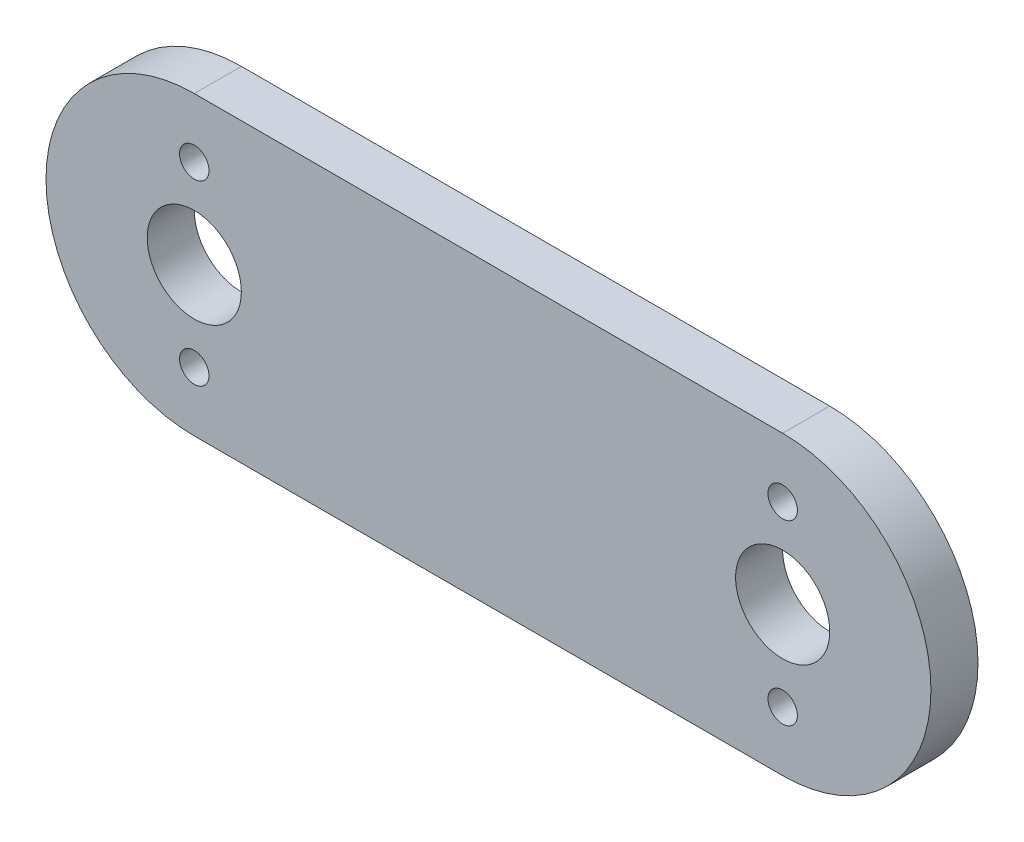
ISO-10303-21;
HEADER;
FILE_DESCRIPTION(('STEP AP214'),'2;1');
FILE_NAME('part.step','',(''),(''),'','','');
FILE_SCHEMA(('AUTOMOTIVE_DESIGN { 1 0 10303 214 1 1 1 1 }'));
ENDSEC;
DATA;
#1=APPLICATION_CONTEXT('core data for automotive mechanical design processes');
#2=APPLICATION_PROTOCOL_DEFINITION('international standard','automotive_design',2000,#1);
#3=PRODUCT_CONTEXT('',#1,'mechanical');
#4=PRODUCT('Part','Part','',(#3));
#5=PRODUCT_RELATED_PRODUCT_CATEGORY('part','',(#4));
#6=PRODUCT_DEFINITION_FORMATION('','',#4);
#7=PRODUCT_DEFINITION_CONTEXT('part definition',#1,'design');
#8=PRODUCT_DEFINITION('design','',#6,#7);
#9=PRODUCT_DEFINITION_SHAPE('','',#8);
#10=(LENGTH_UNIT() NAMED_UNIT(*) SI_UNIT(.MILLI.,.METRE.));
#11=(NAMED_UNIT(*) PLANE_ANGLE_UNIT() SI_UNIT($,.RADIAN.));
#12=(NAMED_UNIT(*) SI_UNIT($,.STERADIAN.) SOLID_ANGLE_UNIT());
#13=UNCERTAINTY_MEASURE_WITH_UNIT(LENGTH_MEASURE(1.E-05),#10,'distance_accuracy_value','');
#14=(GEOMETRIC_REPRESENTATION_CONTEXT(3) GLOBAL_UNCERTAINTY_ASSIGNED_CONTEXT((#13)) GLOBAL_UNIT_ASSIGNED_CONTEXT((#10,
#11,#12)) REPRESENTATION_CONTEXT('',''));
#15=CARTESIAN_POINT('',(0.,0.,0.));
#16=DIRECTION('',(0.,0.,1.));
#17=DIRECTION('',(1.,0.,0.));
#18=AXIS2_PLACEMENT_3D('',#15,#16,#17);
#19=CARTESIAN_POINT('',(0.,0.,4.));
#20=DIRECTION('',(0.,0.,1.));
#21=DIRECTION('',(1.,0.,0.));
#22=AXIS2_PLACEMENT_3D('',#19,#20,#21);
#23=PLANE('',#22);
#24=CARTESIAN_POINT('',(50.,7.55,4.));
#25=DIRECTION('',(0.,0.,1.));
#26=DIRECTION('',(1.,0.,0.));
#27=AXIS2_PLACEMENT_3D('',#24,#25,#26);
#28=CIRCLE('',#27,1.25);
#29=CARTESIAN_POINT('',(51.25,7.55,4.));
#30=VERTEX_POINT('',#29);
#31=EDGE_CURVE('E158',#30,#30,#28,.T.);
#32=ORIENTED_EDGE('',*,*,#31,.F.);
#33=EDGE_LOOP('',(#32));
#34=FACE_BOUND('',#33,.T.);
#35=CARTESIAN_POINT('',(0.,7.55,4.));
#36=DIRECTION('',(0.,0.,1.));
#37=DIRECTION('',(1.,0.,0.));
#38=AXIS2_PLACEMENT_3D('',#35,#36,#37);
#39=CIRCLE('',#38,1.25);
#40=CARTESIAN_POINT('',(1.25,7.55,4.));
#41=VERTEX_POINT('',#40);
#42=EDGE_CURVE('E142',#41,#41,#39,.T.);
#43=ORIENTED_EDGE('',*,*,#42,.F.);
#44=EDGE_LOOP('',(#43));
#45=FACE_BOUND('',#44,.T.);
#46=CARTESIAN_POINT('',(0.,0.,4.));
#47=DIRECTION('',(0.,0.,1.));
#48=DIRECTION('',(1.,0.,0.));
#49=AXIS2_PLACEMENT_3D('',#46,#47,#48);
#50=CIRCLE('',#49,4.);
#51=CARTESIAN_POINT('',(4.,0.,4.));
#52=VERTEX_POINT('',#51);
#53=EDGE_CURVE('E112',#52,#52,#50,.T.);
#54=ORIENTED_EDGE('',*,*,#53,.F.);
#55=EDGE_LOOP('',(#54));
#56=FACE_BOUND('',#55,.T.);
#57=CARTESIAN_POINT('',(0.,0.,4.));
#58=DIRECTION('',(0.,0.,1.));
#59=DIRECTION('',(1.,0.,0.));
#60=AXIS2_PLACEMENT_3D('',#57,#58,#59);
#61=CIRCLE('',#60,12.6);
#62=CARTESIAN_POINT('',(0.,12.6,4.));
#63=VERTEX_POINT('',#62);
#64=CARTESIAN_POINT('',(0.,-12.6,4.));
#65=VERTEX_POINT('',#64);
#66=EDGE_CURVE('E92',#63,#65,#61,.T.);
#67=ORIENTED_EDGE('',*,*,#66,.T.);
#68=DIRECTION('',(1.,0.,0.));
#69=VECTOR('',#68,1.);
#70=CARTESIAN_POINT('',(0.,-12.6,4.));
#71=LINE('',#70,#69);
#72=CARTESIAN_POINT('',(50.,-12.6,4.));
#73=VERTEX_POINT('',#72);
#74=EDGE_CURVE('E87',#65,#73,#71,.T.);
#75=ORIENTED_EDGE('',*,*,#74,.T.);
#76=CARTESIAN_POINT('',(50.,0.,4.));
#77=DIRECTION('',(0.,0.,1.));
#78=DIRECTION('',(-1.,0.,0.));
#79=AXIS2_PLACEMENT_3D('',#76,#77,#78);
#80=CIRCLE('',#79,12.6);
#81=CARTESIAN_POINT('',(50.,12.6,4.));
#82=VERTEX_POINT('',#81);
#83=EDGE_CURVE('E90',#73,#82,#80,.T.);
#84=ORIENTED_EDGE('',*,*,#83,.T.);
#85=DIRECTION('',(-1.,0.,0.));
#86=VECTOR('',#85,1.);
#87=CARTESIAN_POINT('',(0.,12.6,4.));
#88=LINE('',#87,#86);
#89=EDGE_CURVE('E57',#82,#63,#88,.T.);
#90=ORIENTED_EDGE('',*,*,#89,.T.);
#91=EDGE_LOOP('',(#67,#75,#84,#90));
#92=FACE_BOUND('',#91,.T.);
#93=CARTESIAN_POINT('',(50.,0.,4.));
#94=DIRECTION('',(0.,0.,1.));
#95=DIRECTION('',(1.,0.,0.));
#96=AXIS2_PLACEMENT_3D('',#93,#94,#95);
#97=CIRCLE('',#96,4.00000000000001);
#98=CARTESIAN_POINT('',(54.,0.,4.));
#99=VERTEX_POINT('',#98);
#100=EDGE_CURVE('E134',#99,#99,#97,.T.);
#101=ORIENTED_EDGE('',*,*,#100,.F.);
#102=EDGE_LOOP('',(#101));
#103=FACE_BOUND('',#102,.T.);
#104=CARTESIAN_POINT('',(0.,-7.55,4.));
#105=DIRECTION('',(0.,0.,1.));
#106=DIRECTION('',(1.,0.,0.));
#107=AXIS2_PLACEMENT_3D('',#104,#105,#106);
#108=CIRCLE('',#107,1.25);
#109=CARTESIAN_POINT('',(1.25,-7.55,4.));
#110=VERTEX_POINT('',#109);
#111=EDGE_CURVE('E150',#110,#110,#108,.T.);
#112=ORIENTED_EDGE('',*,*,#111,.F.);
#113=EDGE_LOOP('',(#112));
#114=FACE_BOUND('',#113,.T.);
#115=CARTESIAN_POINT('',(50.,-7.55,4.));
#116=DIRECTION('',(0.,0.,1.));
#117=DIRECTION('',(1.,0.,0.));
#118=AXIS2_PLACEMENT_3D('',#115,#116,#117);
#119=CIRCLE('',#118,1.25);
#120=CARTESIAN_POINT('',(51.25,-7.55,4.));
#121=VERTEX_POINT('',#120);
#122=EDGE_CURVE('E166',#121,#121,#119,.T.);
#123=ORIENTED_EDGE('',*,*,#122,.F.);
#124=EDGE_LOOP('',(#123));
#125=FACE_BOUND('',#124,.T.);
#126=ADVANCED_FACE('F39',(#34,#45,#56,#92,#103,#114,#125),#23,.T.);
#127=CARTESIAN_POINT('',(0.,0.,0.));
#128=DIRECTION('',(0.,0.,1.));
#129=DIRECTION('',(1.,0.,0.));
#130=AXIS2_PLACEMENT_3D('',#127,#128,#129);
#131=PLANE('',#130);
#132=CARTESIAN_POINT('',(0.,0.,0.));
#133=DIRECTION('',(0.,0.,1.));
#134=DIRECTION('',(1.,0.,0.));
#135=AXIS2_PLACEMENT_3D('',#132,#133,#134);
#136=CIRCLE('',#135,12.6);
#137=CARTESIAN_POINT('',(0.,12.6,0.));
#138=VERTEX_POINT('',#137);
#139=CARTESIAN_POINT('',(0.,-12.6,0.));
#140=VERTEX_POINT('',#139);
#141=EDGE_CURVE('E108',#138,#140,#136,.T.);
#142=ORIENTED_EDGE('',*,*,#141,.F.);
#143=DIRECTION('',(-1.,0.,0.));
#144=VECTOR('',#143,1.);
#145=CARTESIAN_POINT('',(0.,12.6,0.));
#146=LINE('',#145,#144);
#147=CARTESIAN_POINT('',(50.,12.6,0.));
#148=VERTEX_POINT('',#147);
#149=EDGE_CURVE('E80',#148,#138,#146,.T.);
#150=ORIENTED_EDGE('',*,*,#149,.F.);
#151=CARTESIAN_POINT('',(50.,0.,0.));
#152=DIRECTION('',(0.,0.,1.));
#153=DIRECTION('',(-1.,0.,0.));
#154=AXIS2_PLACEMENT_3D('',#151,#152,#153);
#155=CIRCLE('',#154,12.6);
#156=CARTESIAN_POINT('',(50.,-12.6,0.));
#157=VERTEX_POINT('',#156);
#158=EDGE_CURVE('E74',#157,#148,#155,.T.);
#159=ORIENTED_EDGE('',*,*,#158,.F.);
#160=DIRECTION('',(1.,0.,0.));
#161=VECTOR('',#160,1.);
#162=CARTESIAN_POINT('',(0.,-12.6,0.));
#163=LINE('',#162,#161);
#164=EDGE_CURVE('E97',#140,#157,#163,.T.);
#165=ORIENTED_EDGE('',*,*,#164,.F.);
#166=EDGE_LOOP('',(#142,#150,#159,#165));
#167=FACE_BOUND('',#166,.T.);
#168=CARTESIAN_POINT('',(0.,0.,0.));
#169=DIRECTION('',(0.,0.,1.));
#170=DIRECTION('',(1.,0.,0.));
#171=AXIS2_PLACEMENT_3D('',#168,#169,#170);
#172=CIRCLE('',#171,4.);
#173=CARTESIAN_POINT('',(4.,0.,0.));
#174=VERTEX_POINT('',#173);
#175=EDGE_CURVE('E130',#174,#174,#172,.T.);
#176=ORIENTED_EDGE('',*,*,#175,.T.);
#177=EDGE_LOOP('',(#176));
#178=FACE_BOUND('',#177,.T.);
#179=CARTESIAN_POINT('',(50.,0.,0.));
#180=DIRECTION('',(0.,0.,1.));
#181=DIRECTION('',(1.,0.,0.));
#182=AXIS2_PLACEMENT_3D('',#179,#180,#181);
#183=CIRCLE('',#182,4.00000000000001);
#184=CARTESIAN_POINT('',(54.,0.,0.));
#185=VERTEX_POINT('',#184);
#186=EDGE_CURVE('E138',#185,#185,#183,.T.);
#187=ORIENTED_EDGE('',*,*,#186,.T.);
#188=EDGE_LOOP('',(#187));
#189=FACE_BOUND('',#188,.T.);
#190=CARTESIAN_POINT('',(0.,7.55,0.));
#191=DIRECTION('',(0.,0.,1.));
#192=DIRECTION('',(1.,0.,0.));
#193=AXIS2_PLACEMENT_3D('',#190,#191,#192);
#194=CIRCLE('',#193,1.25);
#195=CARTESIAN_POINT('',(1.25,7.55,0.));
#196=VERTEX_POINT('',#195);
#197=EDGE_CURVE('E146',#196,#196,#194,.T.);
#198=ORIENTED_EDGE('',*,*,#197,.T.);
#199=EDGE_LOOP('',(#198));
#200=FACE_BOUND('',#199,.T.);
#201=CARTESIAN_POINT('',(0.,-7.55,0.));
#202=DIRECTION('',(0.,0.,1.));
#203=DIRECTION('',(1.,0.,0.));
#204=AXIS2_PLACEMENT_3D('',#201,#202,#203);
#205=CIRCLE('',#204,1.25);
#206=CARTESIAN_POINT('',(1.25,-7.55,0.));
#207=VERTEX_POINT('',#206);
#208=EDGE_CURVE('E154',#207,#207,#205,.T.);
#209=ORIENTED_EDGE('',*,*,#208,.T.);
#210=EDGE_LOOP('',(#209));
#211=FACE_BOUND('',#210,.T.);
#212=CARTESIAN_POINT('',(50.,7.55,0.));
#213=DIRECTION('',(0.,0.,1.));
#214=DIRECTION('',(1.,0.,0.));
#215=AXIS2_PLACEMENT_3D('',#212,#213,#214);
#216=CIRCLE('',#215,1.25);
#217=CARTESIAN_POINT('',(51.25,7.55,0.));
#218=VERTEX_POINT('',#217);
#219=EDGE_CURVE('E162',#218,#218,#216,.T.);
#220=ORIENTED_EDGE('',*,*,#219,.T.);
#221=EDGE_LOOP('',(#220));
#222=FACE_BOUND('',#221,.T.);
#223=CARTESIAN_POINT('',(50.,-7.55,0.));
#224=DIRECTION('',(0.,0.,1.));
#225=DIRECTION('',(1.,0.,0.));
#226=AXIS2_PLACEMENT_3D('',#223,#224,#225);
#227=CIRCLE('',#226,1.25);
#228=CARTESIAN_POINT('',(51.25,-7.55,0.));
#229=VERTEX_POINT('',#228);
#230=EDGE_CURVE('E170',#229,#229,#227,.T.);
#231=ORIENTED_EDGE('',*,*,#230,.T.);
#232=EDGE_LOOP('',(#231));
#233=FACE_BOUND('',#232,.T.);
#234=ADVANCED_FACE('F125',(#167,#178,#189,#200,#211,#222,#233),#131,.F.);
#235=CARTESIAN_POINT('',(0.,0.,4.));
#236=DIRECTION('',(0.,0.,-1.));
#237=DIRECTION('',(-1.,0.,0.));
#238=AXIS2_PLACEMENT_3D('',#235,#236,#237);
#239=CYLINDRICAL_SURFACE('',#238,12.6);
#240=ORIENTED_EDGE('',*,*,#141,.T.);
#241=DIRECTION('',(0.,0.,-1.));
#242=VECTOR('',#241,1.);
#243=CARTESIAN_POINT('',(0.,-12.6,4.));
#244=LINE('',#243,#242);
#245=EDGE_CURVE('E11',#65,#140,#244,.T.);
#246=ORIENTED_EDGE('',*,*,#245,.F.);
#247=ORIENTED_EDGE('',*,*,#66,.F.);
#248=DIRECTION('',(0.,0.,-1.));
#249=VECTOR('',#248,1.);
#250=CARTESIAN_POINT('',(0.,12.6,4.));
#251=LINE('',#250,#249);
#252=EDGE_CURVE('E104',#63,#138,#251,.T.);
#253=ORIENTED_EDGE('',*,*,#252,.T.);
#254=EDGE_LOOP('',(#240,#246,#247,#253));
#255=FACE_BOUND('',#254,.T.);
#256=ADVANCED_FACE('F41',(#255),#239,.T.);
#257=CARTESIAN_POINT('',(0.,-12.6,4.));
#258=DIRECTION('',(0.,1.,0.));
#259=DIRECTION('',(0.,0.,1.));
#260=AXIS2_PLACEMENT_3D('',#257,#258,#259);
#261=PLANE('',#260);
#262=ORIENTED_EDGE('',*,*,#164,.T.);
#263=DIRECTION('',(0.,0.,-1.));
#264=VECTOR('',#263,1.);
#265=CARTESIAN_POINT('',(50.,-12.6,4.));
#266=LINE('',#265,#264);
#267=EDGE_CURVE('E49',#73,#157,#266,.T.);
#268=ORIENTED_EDGE('',*,*,#267,.F.);
#269=ORIENTED_EDGE('',*,*,#74,.F.);
#270=ORIENTED_EDGE('',*,*,#245,.T.);
#271=EDGE_LOOP('',(#262,#268,#269,#270));
#272=FACE_BOUND('',#271,.T.);
#273=ADVANCED_FACE('F96',(#272),#261,.F.);
#274=CARTESIAN_POINT('',(50.,0.,4.));
#275=DIRECTION('',(0.,0.,-1.));
#276=DIRECTION('',(-1.,0.,0.));
#277=AXIS2_PLACEMENT_3D('',#274,#275,#276);
#278=CYLINDRICAL_SURFACE('',#277,12.6);
#279=ORIENTED_EDGE('',*,*,#158,.T.);
#280=DIRECTION('',(0.,0.,-1.));
#281=VECTOR('',#280,1.);
#282=CARTESIAN_POINT('',(50.,12.6,4.));
#283=LINE('',#282,#281);
#284=EDGE_CURVE('E99',#82,#148,#283,.T.);
#285=ORIENTED_EDGE('',*,*,#284,.F.);
#286=ORIENTED_EDGE('',*,*,#83,.F.);
#287=ORIENTED_EDGE('',*,*,#267,.T.);
#288=EDGE_LOOP('',(#279,#285,#286,#287));
#289=FACE_BOUND('',#288,.T.);
#290=ADVANCED_FACE('F100',(#289),#278,.T.);
#291=CARTESIAN_POINT('',(0.,12.6,4.));
#292=DIRECTION('',(0.,-1.,0.));
#293=DIRECTION('',(0.,0.,-1.));
#294=AXIS2_PLACEMENT_3D('',#291,#292,#293);
#295=PLANE('',#294);
#296=ORIENTED_EDGE('',*,*,#149,.T.);
#297=ORIENTED_EDGE('',*,*,#252,.F.);
#298=ORIENTED_EDGE('',*,*,#89,.F.);
#299=ORIENTED_EDGE('',*,*,#284,.T.);
#300=EDGE_LOOP('',(#296,#297,#298,#299));
#301=FACE_BOUND('',#300,.T.);
#302=ADVANCED_FACE('F122',(#301),#295,.F.);
#303=CARTESIAN_POINT('',(0.,0.,4.));
#304=DIRECTION('',(0.,0.,-1.));
#305=DIRECTION('',(-1.,0.,0.));
#306=AXIS2_PLACEMENT_3D('',#303,#304,#305);
#307=CYLINDRICAL_SURFACE('',#306,4.);
#308=ORIENTED_EDGE('',*,*,#53,.T.);
#309=EDGE_LOOP('',(#308));
#310=FACE_BOUND('',#309,.T.);
#311=ORIENTED_EDGE('',*,*,#175,.F.);
#312=EDGE_LOOP('',(#311));
#313=FACE_BOUND('',#312,.T.);
#314=ADVANCED_FACE('F191',(#310,#313),#307,.F.);
#315=CARTESIAN_POINT('',(50.,0.,4.));
#316=DIRECTION('',(0.,0.,-1.));
#317=DIRECTION('',(-1.,0.,0.));
#318=AXIS2_PLACEMENT_3D('',#315,#316,#317);
#319=CYLINDRICAL_SURFACE('',#318,4.00000000000001);
#320=ORIENTED_EDGE('',*,*,#100,.T.);
#321=EDGE_LOOP('',(#320));
#322=FACE_BOUND('',#321,.T.);
#323=ORIENTED_EDGE('',*,*,#186,.F.);
#324=EDGE_LOOP('',(#323));
#325=FACE_BOUND('',#324,.T.);
#326=ADVANCED_FACE('F237',(#322,#325),#319,.F.);
#327=CARTESIAN_POINT('',(0.,7.55,4.));
#328=DIRECTION('',(0.,0.,-1.));
#329=DIRECTION('',(-1.,0.,0.));
#330=AXIS2_PLACEMENT_3D('',#327,#328,#329);
#331=CYLINDRICAL_SURFACE('',#330,1.25);
#332=ORIENTED_EDGE('',*,*,#42,.T.);
#333=EDGE_LOOP('',(#332));
#334=FACE_BOUND('',#333,.T.);
#335=ORIENTED_EDGE('',*,*,#197,.F.);
#336=EDGE_LOOP('',(#335));
#337=FACE_BOUND('',#336,.T.);
#338=ADVANCED_FACE('F245',(#334,#337),#331,.F.);
#339=CARTESIAN_POINT('',(0.,-7.55,4.));
#340=DIRECTION('',(0.,0.,-1.));
#341=DIRECTION('',(-1.,0.,0.));
#342=AXIS2_PLACEMENT_3D('',#339,#340,#341);
#343=CYLINDRICAL_SURFACE('',#342,1.25);
#344=ORIENTED_EDGE('',*,*,#111,.T.);
#345=EDGE_LOOP('',(#344));
#346=FACE_BOUND('',#345,.T.);
#347=ORIENTED_EDGE('',*,*,#208,.F.);
#348=EDGE_LOOP('',(#347));
#349=FACE_BOUND('',#348,.T.);
#350=ADVANCED_FACE('F253',(#346,#349),#343,.F.);
#351=CARTESIAN_POINT('',(50.,7.55,4.));
#352=DIRECTION('',(0.,0.,-1.));
#353=DIRECTION('',(-1.,0.,0.));
#354=AXIS2_PLACEMENT_3D('',#351,#352,#353);
#355=CYLINDRICAL_SURFACE('',#354,1.25);
#356=ORIENTED_EDGE('',*,*,#31,.T.);
#357=EDGE_LOOP('',(#356));
#358=FACE_BOUND('',#357,.T.);
#359=ORIENTED_EDGE('',*,*,#219,.F.);
#360=EDGE_LOOP('',(#359));
#361=FACE_BOUND('',#360,.T.);
#362=ADVANCED_FACE('F262',(#358,#361),#355,.F.);
#363=CARTESIAN_POINT('',(50.,-7.55,4.));
#364=DIRECTION('',(0.,0.,-1.));
#365=DIRECTION('',(-1.,0.,0.));
#366=AXIS2_PLACEMENT_3D('',#363,#364,#365);
#367=CYLINDRICAL_SURFACE('',#366,1.25);
#368=ORIENTED_EDGE('',*,*,#122,.T.);
#369=EDGE_LOOP('',(#368));
#370=FACE_BOUND('',#369,.T.);
#371=ORIENTED_EDGE('',*,*,#230,.F.);
#372=EDGE_LOOP('',(#371));
#373=FACE_BOUND('',#372,.T.);
#374=ADVANCED_FACE('F178',(#370,#373),#367,.F.);
#375=CLOSED_SHELL('',(#126,#234,#256,#273,#290,#302,#314,#326,#338,#350,#362,#374));
#376=MANIFOLD_SOLID_BREP('B2',#375);
#377=ADVANCED_BREP_SHAPE_REPRESENTATION('',(#18,#376),#14);
#378=SHAPE_DEFINITION_REPRESENTATION(#9,#377);
ENDSEC;
END-ISO-10303-21;
